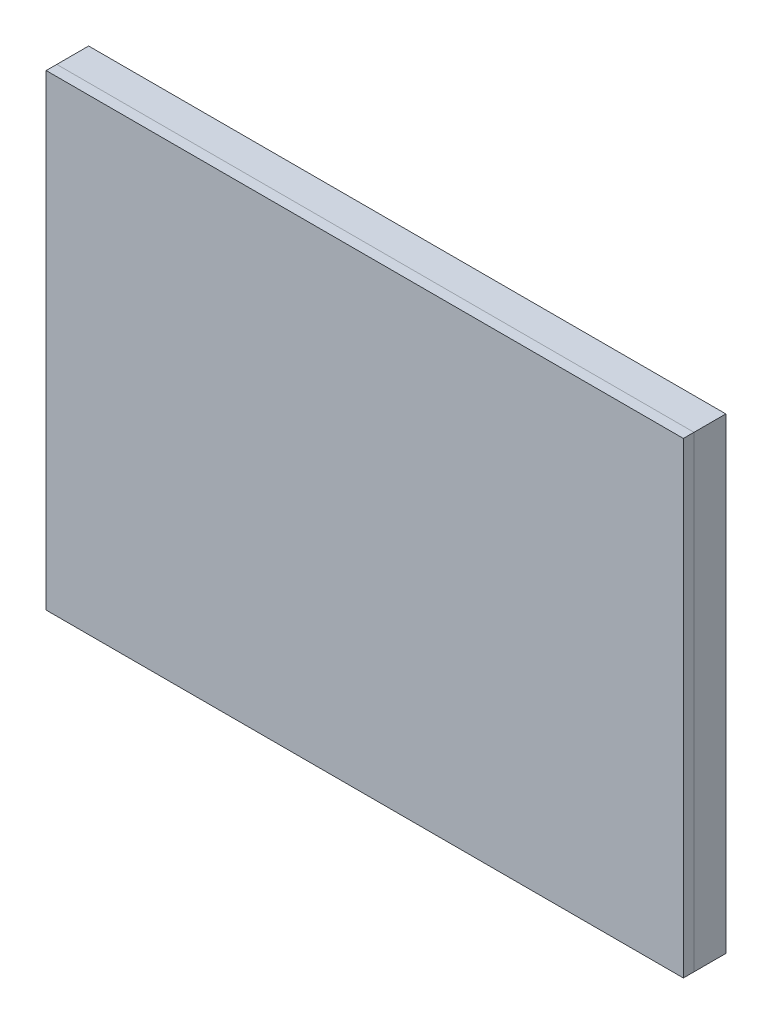
ISO-10303-21;
HEADER;
FILE_DESCRIPTION(('STEP AP214'),'2;1');
FILE_NAME('part.step','',(''),(''),'','','');
FILE_SCHEMA(('AUTOMOTIVE_DESIGN { 1 0 10303 214 1 1 1 1 }'));
ENDSEC;
DATA;
#1=APPLICATION_CONTEXT('core data for automotive mechanical design processes');
#2=APPLICATION_PROTOCOL_DEFINITION('international standard','automotive_design',2000,#1);
#3=PRODUCT_CONTEXT('',#1,'mechanical');
#4=PRODUCT('Part','Part','',(#3));
#5=PRODUCT_RELATED_PRODUCT_CATEGORY('part','',(#4));
#6=PRODUCT_DEFINITION_FORMATION('','',#4);
#7=PRODUCT_DEFINITION_CONTEXT('part definition',#1,'design');
#8=PRODUCT_DEFINITION('design','',#6,#7);
#9=PRODUCT_DEFINITION_SHAPE('','',#8);
#10=(LENGTH_UNIT() NAMED_UNIT(*) SI_UNIT(.MILLI.,.METRE.));
#11=(NAMED_UNIT(*) PLANE_ANGLE_UNIT() SI_UNIT($,.RADIAN.));
#12=(NAMED_UNIT(*) SI_UNIT($,.STERADIAN.) SOLID_ANGLE_UNIT());
#13=UNCERTAINTY_MEASURE_WITH_UNIT(LENGTH_MEASURE(1.E-05),#10,'distance_accuracy_value','');
#14=(GEOMETRIC_REPRESENTATION_CONTEXT(3) GLOBAL_UNCERTAINTY_ASSIGNED_CONTEXT((#13)) GLOBAL_UNIT_ASSIGNED_CONTEXT((#10,
#11,#12)) REPRESENTATION_CONTEXT('',''));
#15=CARTESIAN_POINT('',(0.,0.,0.));
#16=DIRECTION('',(0.,0.,1.));
#17=DIRECTION('',(1.,0.,0.));
#18=AXIS2_PLACEMENT_3D('',#15,#16,#17);
#19=CARTESIAN_POINT('',(-30.,22.,4.));
#20=DIRECTION('',(1.,0.,0.));
#21=DIRECTION('',(0.,0.,-1.));
#22=AXIS2_PLACEMENT_3D('',#19,#20,#21);
#23=PLANE('',#22);
#24=DIRECTION('',(0.,-1.,0.));
#25=VECTOR('',#24,1.);
#26=CARTESIAN_POINT('',(-30.,22.,3.));
#27=LINE('',#26,#25);
#28=CARTESIAN_POINT('',(-30.,22.,3.));
#29=VERTEX_POINT('',#28);
#30=CARTESIAN_POINT('',(-30.,-22.,3.));
#31=VERTEX_POINT('',#30);
#32=EDGE_CURVE('E107',#29,#31,#27,.T.);
#33=ORIENTED_EDGE('',*,*,#32,.T.);
#34=DIRECTION('',(0.,0.,-1.));
#35=VECTOR('',#34,1.);
#36=CARTESIAN_POINT('',(-30.,-22.,4.));
#37=LINE('',#36,#35);
#38=CARTESIAN_POINT('',(-30.,-22.,4.));
#39=VERTEX_POINT('',#38);
#40=EDGE_CURVE('E12',#39,#31,#37,.T.);
#41=ORIENTED_EDGE('',*,*,#40,.F.);
#42=DIRECTION('',(0.,-1.,0.));
#43=VECTOR('',#42,1.);
#44=CARTESIAN_POINT('',(-30.,22.,4.));
#45=LINE('',#44,#43);
#46=CARTESIAN_POINT('',(-30.,22.,4.));
#47=VERTEX_POINT('',#46);
#48=EDGE_CURVE('E95',#47,#39,#45,.T.);
#49=ORIENTED_EDGE('',*,*,#48,.F.);
#50=DIRECTION('',(0.,0.,-1.));
#51=VECTOR('',#50,1.);
#52=CARTESIAN_POINT('',(-30.,22.,4.));
#53=LINE('',#52,#51);
#54=EDGE_CURVE('E103',#47,#29,#53,.T.);
#55=ORIENTED_EDGE('',*,*,#54,.T.);
#56=EDGE_LOOP('',(#33,#41,#49,#55));
#57=FACE_BOUND('',#56,.T.);
#58=ADVANCED_FACE('F44',(#57),#23,.F.);
#59=CARTESIAN_POINT('',(-30.,-22.,4.));
#60=DIRECTION('',(0.,1.,0.));
#61=DIRECTION('',(0.,0.,1.));
#62=AXIS2_PLACEMENT_3D('',#59,#60,#61);
#63=PLANE('',#62);
#64=DIRECTION('',(1.,0.,0.));
#65=VECTOR('',#64,1.);
#66=CARTESIAN_POINT('',(-30.,-22.,3.));
#67=LINE('',#66,#65);
#68=CARTESIAN_POINT('',(30.,-22.,3.));
#69=VERTEX_POINT('',#68);
#70=EDGE_CURVE('E99',#31,#69,#67,.T.);
#71=ORIENTED_EDGE('',*,*,#70,.T.);
#72=DIRECTION('',(0.,0.,-1.));
#73=VECTOR('',#72,1.);
#74=CARTESIAN_POINT('',(30.,-22.,4.));
#75=LINE('',#74,#73);
#76=CARTESIAN_POINT('',(30.,-22.,4.));
#77=VERTEX_POINT('',#76);
#78=EDGE_CURVE('E52',#77,#69,#75,.T.);
#79=ORIENTED_EDGE('',*,*,#78,.F.);
#80=DIRECTION('',(1.,0.,0.));
#81=VECTOR('',#80,1.);
#82=CARTESIAN_POINT('',(-30.,-22.,4.));
#83=LINE('',#82,#81);
#84=EDGE_CURVE('E90',#39,#77,#83,.T.);
#85=ORIENTED_EDGE('',*,*,#84,.F.);
#86=ORIENTED_EDGE('',*,*,#40,.T.);
#87=EDGE_LOOP('',(#71,#79,#85,#86));
#88=FACE_BOUND('',#87,.T.);
#89=ADVANCED_FACE('F98',(#88),#63,.F.);
#90=CARTESIAN_POINT('',(30.,22.,4.));
#91=DIRECTION('',(-1.,0.,0.));
#92=DIRECTION('',(0.,0.,1.));
#93=AXIS2_PLACEMENT_3D('',#90,#91,#92);
#94=PLANE('',#93);
#95=DIRECTION('',(0.,1.,0.));
#96=VECTOR('',#95,1.);
#97=CARTESIAN_POINT('',(30.,22.,3.));
#98=LINE('',#97,#96);
#99=CARTESIAN_POINT('',(30.,22.,3.));
#100=VERTEX_POINT('',#99);
#101=EDGE_CURVE('E77',#69,#100,#98,.T.);
#102=ORIENTED_EDGE('',*,*,#101,.T.);
#103=DIRECTION('',(0.,0.,-1.));
#104=VECTOR('',#103,1.);
#105=CARTESIAN_POINT('',(30.,22.,4.));
#106=LINE('',#105,#104);
#107=CARTESIAN_POINT('',(30.,22.,4.));
#108=VERTEX_POINT('',#107);
#109=EDGE_CURVE('E100',#108,#100,#106,.T.);
#110=ORIENTED_EDGE('',*,*,#109,.F.);
#111=DIRECTION('',(0.,1.,0.));
#112=VECTOR('',#111,1.);
#113=CARTESIAN_POINT('',(30.,22.,4.));
#114=LINE('',#113,#112);
#115=EDGE_CURVE('E93',#77,#108,#114,.T.);
#116=ORIENTED_EDGE('',*,*,#115,.F.);
#117=ORIENTED_EDGE('',*,*,#78,.T.);
#118=EDGE_LOOP('',(#102,#110,#116,#117));
#119=FACE_BOUND('',#118,.T.);
#120=ADVANCED_FACE('F101',(#119),#94,.F.);
#121=CARTESIAN_POINT('',(-30.,22.,4.));
#122=DIRECTION('',(0.,-1.,0.));
#123=DIRECTION('',(0.,0.,-1.));
#124=AXIS2_PLACEMENT_3D('',#121,#122,#123);
#125=PLANE('',#124);
#126=DIRECTION('',(-1.,0.,0.));
#127=VECTOR('',#126,1.);
#128=CARTESIAN_POINT('',(-30.,22.,3.));
#129=LINE('',#128,#127);
#130=EDGE_CURVE('E83',#100,#29,#129,.T.);
#131=ORIENTED_EDGE('',*,*,#130,.T.);
#132=ORIENTED_EDGE('',*,*,#54,.F.);
#133=DIRECTION('',(-1.,0.,0.));
#134=VECTOR('',#133,1.);
#135=CARTESIAN_POINT('',(-30.,22.,4.));
#136=LINE('',#135,#134);
#137=EDGE_CURVE('E60',#108,#47,#136,.T.);
#138=ORIENTED_EDGE('',*,*,#137,.F.);
#139=ORIENTED_EDGE('',*,*,#109,.T.);
#140=EDGE_LOOP('',(#131,#132,#138,#139));
#141=FACE_BOUND('',#140,.T.);
#142=ADVANCED_FACE('F114',(#141),#125,.F.);
#143=CARTESIAN_POINT('',(0.,0.,4.));
#144=DIRECTION('',(0.,0.,1.));
#145=DIRECTION('',(1.,0.,0.));
#146=AXIS2_PLACEMENT_3D('',#143,#144,#145);
#147=PLANE('',#146);
#148=ORIENTED_EDGE('',*,*,#48,.T.);
#149=ORIENTED_EDGE('',*,*,#84,.T.);
#150=ORIENTED_EDGE('',*,*,#115,.T.);
#151=ORIENTED_EDGE('',*,*,#137,.T.);
#152=EDGE_LOOP('',(#148,#149,#150,#151));
#153=FACE_BOUND('',#152,.T.);
#154=ADVANCED_FACE('F91',(#153),#147,.T.);
#155=CARTESIAN_POINT('',(0.,0.,3.));
#156=DIRECTION('',(0.,0.,1.));
#157=DIRECTION('',(1.,0.,0.));
#158=AXIS2_PLACEMENT_3D('',#155,#156,#157);
#159=PLANE('',#158);
#160=ORIENTED_EDGE('',*,*,#32,.F.);
#161=ORIENTED_EDGE('',*,*,#130,.F.);
#162=ORIENTED_EDGE('',*,*,#101,.F.);
#163=ORIENTED_EDGE('',*,*,#70,.F.);
#164=EDGE_LOOP('',(#160,#161,#162,#163));
#165=FACE_BOUND('',#164,.T.);
#166=ADVANCED_FACE('F117',(#165),#159,.F.);
#167=CLOSED_SHELL('',(#58,#89,#120,#142,#154,#166));
#168=MANIFOLD_SOLID_BREP('B2',#167);
#169=CARTESIAN_POINT('',(30.,22.,3.));
#170=DIRECTION('',(-1.,0.,0.));
#171=DIRECTION('',(0.,-1.,0.));
#172=AXIS2_PLACEMENT_3D('',#169,#170,#171);
#173=PLANE('',#172);
#174=DIRECTION('',(0.,1.,0.));
#175=VECTOR('',#174,1.);
#176=CARTESIAN_POINT('',(30.,22.,0.));
#177=LINE('',#176,#175);
#178=CARTESIAN_POINT('',(30.,-22.,0.));
#179=VERTEX_POINT('',#178);
#180=CARTESIAN_POINT('',(30.,22.,0.));
#181=VERTEX_POINT('',#180);
#182=EDGE_CURVE('E230',#179,#181,#177,.T.);
#183=ORIENTED_EDGE('',*,*,#182,.T.);
#184=DIRECTION('',(0.,0.,-1.));
#185=VECTOR('',#184,1.);
#186=CARTESIAN_POINT('',(30.,22.,3.));
#187=LINE('',#186,#185);
#188=CARTESIAN_POINT('',(30.,22.,3.));
#189=VERTEX_POINT('',#188);
#190=EDGE_CURVE('E42',#189,#181,#187,.T.);
#191=ORIENTED_EDGE('',*,*,#190,.F.);
#192=DIRECTION('',(0.,1.,0.));
#193=VECTOR('',#192,1.);
#194=CARTESIAN_POINT('',(30.,22.,3.));
#195=LINE('',#194,#193);
#196=CARTESIAN_POINT('',(30.,-22.,3.));
#197=VERTEX_POINT('',#196);
#198=EDGE_CURVE('E218',#197,#189,#195,.T.);
#199=ORIENTED_EDGE('',*,*,#198,.F.);
#200=DIRECTION('',(0.,0.,-1.));
#201=VECTOR('',#200,1.);
#202=CARTESIAN_POINT('',(30.,-22.,3.));
#203=LINE('',#202,#201);
#204=EDGE_CURVE('E226',#197,#179,#203,.T.);
#205=ORIENTED_EDGE('',*,*,#204,.T.);
#206=EDGE_LOOP('',(#183,#191,#199,#205));
#207=FACE_BOUND('',#206,.T.);
#208=ADVANCED_FACE('F167',(#207),#173,.F.);
#209=CARTESIAN_POINT('',(-30.,22.,3.));
#210=DIRECTION('',(0.,-1.,0.));
#211=DIRECTION('',(0.,0.,-1.));
#212=AXIS2_PLACEMENT_3D('',#209,#210,#211);
#213=PLANE('',#212);
#214=DIRECTION('',(-1.,0.,0.));
#215=VECTOR('',#214,1.);
#216=CARTESIAN_POINT('',(-30.,22.,0.));
#217=LINE('',#216,#215);
#218=CARTESIAN_POINT('',(-30.,22.,0.));
#219=VERTEX_POINT('',#218);
#220=EDGE_CURVE('E222',#181,#219,#217,.T.);
#221=ORIENTED_EDGE('',*,*,#220,.T.);
#222=DIRECTION('',(0.,0.,-1.));
#223=VECTOR('',#222,1.);
#224=CARTESIAN_POINT('',(-30.,22.,3.));
#225=LINE('',#224,#223);
#226=CARTESIAN_POINT('',(-30.,22.,3.));
#227=VERTEX_POINT('',#226);
#228=EDGE_CURVE('E175',#227,#219,#225,.T.);
#229=ORIENTED_EDGE('',*,*,#228,.F.);
#230=DIRECTION('',(-1.,0.,0.));
#231=VECTOR('',#230,1.);
#232=CARTESIAN_POINT('',(-30.,22.,3.));
#233=LINE('',#232,#231);
#234=EDGE_CURVE('E213',#189,#227,#233,.T.);
#235=ORIENTED_EDGE('',*,*,#234,.F.);
#236=ORIENTED_EDGE('',*,*,#190,.T.);
#237=EDGE_LOOP('',(#221,#229,#235,#236));
#238=FACE_BOUND('',#237,.T.);
#239=ADVANCED_FACE('F221',(#238),#213,.F.);
#240=CARTESIAN_POINT('',(-30.,22.,3.));
#241=DIRECTION('',(1.,0.,0.));
#242=DIRECTION('',(0.,1.,0.));
#243=AXIS2_PLACEMENT_3D('',#240,#241,#242);
#244=PLANE('',#243);
#245=DIRECTION('',(0.,-1.,0.));
#246=VECTOR('',#245,1.);
#247=CARTESIAN_POINT('',(-30.,22.,0.));
#248=LINE('',#247,#246);
#249=CARTESIAN_POINT('',(-30.,-22.,0.));
#250=VERTEX_POINT('',#249);
#251=EDGE_CURVE('E200',#219,#250,#248,.T.);
#252=ORIENTED_EDGE('',*,*,#251,.T.);
#253=DIRECTION('',(0.,0.,-1.));
#254=VECTOR('',#253,1.);
#255=CARTESIAN_POINT('',(-30.,-22.,3.));
#256=LINE('',#255,#254);
#257=CARTESIAN_POINT('',(-30.,-22.,3.));
#258=VERTEX_POINT('',#257);
#259=EDGE_CURVE('E223',#258,#250,#256,.T.);
#260=ORIENTED_EDGE('',*,*,#259,.F.);
#261=DIRECTION('',(0.,-1.,0.));
#262=VECTOR('',#261,1.);
#263=CARTESIAN_POINT('',(-30.,22.,3.));
#264=LINE('',#263,#262);
#265=EDGE_CURVE('E216',#227,#258,#264,.T.);
#266=ORIENTED_EDGE('',*,*,#265,.F.);
#267=ORIENTED_EDGE('',*,*,#228,.T.);
#268=EDGE_LOOP('',(#252,#260,#266,#267));
#269=FACE_BOUND('',#268,.T.);
#270=ADVANCED_FACE('F224',(#269),#244,.F.);
#271=CARTESIAN_POINT('',(-30.,-22.,3.));
#272=DIRECTION('',(0.,1.,0.));
#273=DIRECTION('',(0.,0.,1.));
#274=AXIS2_PLACEMENT_3D('',#271,#272,#273);
#275=PLANE('',#274);
#276=DIRECTION('',(1.,0.,0.));
#277=VECTOR('',#276,1.);
#278=CARTESIAN_POINT('',(-30.,-22.,0.));
#279=LINE('',#278,#277);
#280=EDGE_CURVE('E206',#250,#179,#279,.T.);
#281=ORIENTED_EDGE('',*,*,#280,.T.);
#282=ORIENTED_EDGE('',*,*,#204,.F.);
#283=DIRECTION('',(1.,0.,0.));
#284=VECTOR('',#283,1.);
#285=CARTESIAN_POINT('',(-30.,-22.,3.));
#286=LINE('',#285,#284);
#287=EDGE_CURVE('E183',#258,#197,#286,.T.);
#288=ORIENTED_EDGE('',*,*,#287,.F.);
#289=ORIENTED_EDGE('',*,*,#259,.T.);
#290=EDGE_LOOP('',(#281,#282,#288,#289));
#291=FACE_BOUND('',#290,.T.);
#292=ADVANCED_FACE('F237',(#291),#275,.F.);
#293=CARTESIAN_POINT('',(0.,0.,3.));
#294=DIRECTION('',(0.,0.,1.));
#295=DIRECTION('',(1.,0.,0.));
#296=AXIS2_PLACEMENT_3D('',#293,#294,#295);
#297=PLANE('',#296);
#298=ORIENTED_EDGE('',*,*,#198,.T.);
#299=ORIENTED_EDGE('',*,*,#234,.T.);
#300=ORIENTED_EDGE('',*,*,#265,.T.);
#301=ORIENTED_EDGE('',*,*,#287,.T.);
#302=EDGE_LOOP('',(#298,#299,#300,#301));
#303=FACE_BOUND('',#302,.T.);
#304=ADVANCED_FACE('F214',(#303),#297,.T.);
#305=CARTESIAN_POINT('',(0.,0.,0.));
#306=DIRECTION('',(0.,0.,1.));
#307=DIRECTION('',(1.,0.,0.));
#308=AXIS2_PLACEMENT_3D('',#305,#306,#307);
#309=PLANE('',#308);
#310=ORIENTED_EDGE('',*,*,#182,.F.);
#311=ORIENTED_EDGE('',*,*,#280,.F.);
#312=ORIENTED_EDGE('',*,*,#251,.F.);
#313=ORIENTED_EDGE('',*,*,#220,.F.);
#314=EDGE_LOOP('',(#310,#311,#312,#313));
#315=FACE_BOUND('',#314,.T.);
#316=ADVANCED_FACE('F240',(#315),#309,.F.);
#317=CLOSED_SHELL('',(#208,#239,#270,#292,#304,#316));
#318=MANIFOLD_SOLID_BREP('B6',#317);
#319=ADVANCED_BREP_SHAPE_REPRESENTATION('',(#18,#168,#318),#14);
#320=SHAPE_DEFINITION_REPRESENTATION(#9,#319);
ENDSEC;
END-ISO-10303-21;
